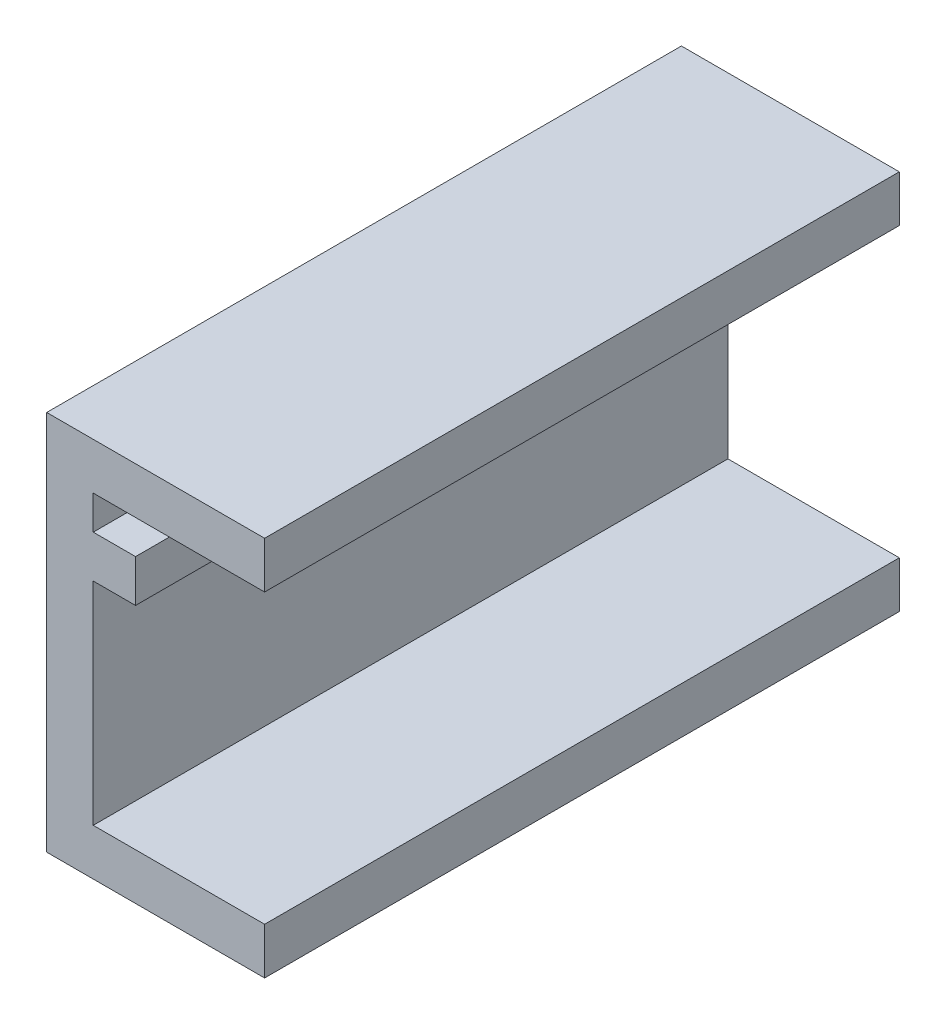
ISO-10303-21;
HEADER;
FILE_DESCRIPTION(('STEP AP214'),'2;1');
FILE_NAME('part.step','',(''),(''),'','','');
FILE_SCHEMA(('AUTOMOTIVE_DESIGN { 1 0 10303 214 1 1 1 1 }'));
ENDSEC;
DATA;
#1=APPLICATION_CONTEXT('core data for automotive mechanical design processes');
#2=APPLICATION_PROTOCOL_DEFINITION('international standard','automotive_design',2000,#1);
#3=PRODUCT_CONTEXT('',#1,'mechanical');
#4=PRODUCT('Part','Part','',(#3));
#5=PRODUCT_RELATED_PRODUCT_CATEGORY('part','',(#4));
#6=PRODUCT_DEFINITION_FORMATION('','',#4);
#7=PRODUCT_DEFINITION_CONTEXT('part definition',#1,'design');
#8=PRODUCT_DEFINITION('design','',#6,#7);
#9=PRODUCT_DEFINITION_SHAPE('','',#8);
#10=(LENGTH_UNIT() NAMED_UNIT(*) SI_UNIT(.MILLI.,.METRE.));
#11=(NAMED_UNIT(*) PLANE_ANGLE_UNIT() SI_UNIT($,.RADIAN.));
#12=(NAMED_UNIT(*) SI_UNIT($,.STERADIAN.) SOLID_ANGLE_UNIT());
#13=UNCERTAINTY_MEASURE_WITH_UNIT(LENGTH_MEASURE(1.E-05),#10,'distance_accuracy_value','');
#14=(GEOMETRIC_REPRESENTATION_CONTEXT(3) GLOBAL_UNCERTAINTY_ASSIGNED_CONTEXT((#13)) GLOBAL_UNIT_ASSIGNED_CONTEXT((#10,
#11,#12)) REPRESENTATION_CONTEXT('',''));
#15=CARTESIAN_POINT('',(0.,0.,0.));
#16=DIRECTION('',(0.,0.,1.));
#17=DIRECTION('',(1.,0.,0.));
#18=AXIS2_PLACEMENT_3D('',#15,#16,#17);
#19=CARTESIAN_POINT('',(-10.3,0.,30.));
#20=DIRECTION('',(0.,1.,0.));
#21=DIRECTION('',(0.,0.,1.));
#22=AXIS2_PLACEMENT_3D('',#19,#20,#21);
#23=PLANE('',#22);
#24=DIRECTION('',(1.,0.,0.));
#25=VECTOR('',#24,1.);
#26=CARTESIAN_POINT('',(-10.3,0.,0.));
#27=LINE('',#26,#25);
#28=CARTESIAN_POINT('',(-10.3,0.,0.));
#29=VERTEX_POINT('',#28);
#30=CARTESIAN_POINT('',(0.,0.,0.));
#31=VERTEX_POINT('',#30);
#32=EDGE_CURVE('E160',#29,#31,#27,.T.);
#33=ORIENTED_EDGE('',*,*,#32,.T.);
#34=DIRECTION('',(0.,0.,-1.));
#35=VECTOR('',#34,1.);
#36=CARTESIAN_POINT('',(0.,0.,30.));
#37=LINE('',#36,#35);
#38=CARTESIAN_POINT('',(0.,0.,30.));
#39=VERTEX_POINT('',#38);
#40=EDGE_CURVE('E11',#39,#31,#37,.T.);
#41=ORIENTED_EDGE('',*,*,#40,.F.);
#42=DIRECTION('',(1.,0.,0.));
#43=VECTOR('',#42,1.);
#44=CARTESIAN_POINT('',(-10.3,0.,30.));
#45=LINE('',#44,#43);
#46=CARTESIAN_POINT('',(-10.3,0.,30.));
#47=VERTEX_POINT('',#46);
#48=EDGE_CURVE('E182',#47,#39,#45,.T.);
#49=ORIENTED_EDGE('',*,*,#48,.F.);
#50=DIRECTION('',(0.,0.,-1.));
#51=VECTOR('',#50,1.);
#52=CARTESIAN_POINT('',(-10.3,0.,30.));
#53=LINE('',#52,#51);
#54=EDGE_CURVE('E156',#47,#29,#53,.T.);
#55=ORIENTED_EDGE('',*,*,#54,.T.);
#56=EDGE_LOOP('',(#33,#41,#49,#55));
#57=FACE_BOUND('',#56,.T.);
#58=ADVANCED_FACE('F40',(#57),#23,.F.);
#59=CARTESIAN_POINT('',(0.,2.2,30.));
#60=DIRECTION('',(-1.,0.,0.));
#61=DIRECTION('',(0.,0.,1.));
#62=AXIS2_PLACEMENT_3D('',#59,#60,#61);
#63=PLANE('',#62);
#64=DIRECTION('',(0.,1.,0.));
#65=VECTOR('',#64,1.);
#66=CARTESIAN_POINT('',(0.,2.2,0.));
#67=LINE('',#66,#65);
#68=CARTESIAN_POINT('',(0.,2.2,0.));
#69=VERTEX_POINT('',#68);
#70=EDGE_CURVE('E163',#31,#69,#67,.T.);
#71=ORIENTED_EDGE('',*,*,#70,.T.);
#72=DIRECTION('',(0.,0.,-1.));
#73=VECTOR('',#72,1.);
#74=CARTESIAN_POINT('',(0.,2.2,30.));
#75=LINE('',#74,#73);
#76=CARTESIAN_POINT('',(0.,2.2,30.));
#77=VERTEX_POINT('',#76);
#78=EDGE_CURVE('E48',#77,#69,#75,.T.);
#79=ORIENTED_EDGE('',*,*,#78,.F.);
#80=DIRECTION('',(0.,1.,0.));
#81=VECTOR('',#80,1.);
#82=CARTESIAN_POINT('',(0.,2.2,30.));
#83=LINE('',#82,#81);
#84=EDGE_CURVE('E111',#39,#77,#83,.T.);
#85=ORIENTED_EDGE('',*,*,#84,.F.);
#86=ORIENTED_EDGE('',*,*,#40,.T.);
#87=EDGE_LOOP('',(#71,#79,#85,#86));
#88=FACE_BOUND('',#87,.T.);
#89=ADVANCED_FACE('F260',(#88),#63,.F.);
#90=CARTESIAN_POINT('',(-8.1,2.2,30.));
#91=DIRECTION('',(0.,-1.,0.));
#92=DIRECTION('',(1.,0.,0.));
#93=AXIS2_PLACEMENT_3D('',#90,#91,#92);
#94=PLANE('',#93);
#95=DIRECTION('',(-1.,0.,0.));
#96=VECTOR('',#95,1.);
#97=CARTESIAN_POINT('',(-8.1,2.2,0.));
#98=LINE('',#97,#96);
#99=CARTESIAN_POINT('',(-8.1,2.2,0.));
#100=VERTEX_POINT('',#99);
#101=EDGE_CURVE('E165',#69,#100,#98,.T.);
#102=ORIENTED_EDGE('',*,*,#101,.T.);
#103=DIRECTION('',(0.,0.,-1.));
#104=VECTOR('',#103,1.);
#105=CARTESIAN_POINT('',(-8.1,2.2,30.));
#106=LINE('',#105,#104);
#107=CARTESIAN_POINT('',(-8.1,2.2,30.));
#108=VERTEX_POINT('',#107);
#109=EDGE_CURVE('E201',#108,#100,#106,.T.);
#110=ORIENTED_EDGE('',*,*,#109,.F.);
#111=DIRECTION('',(-1.,0.,0.));
#112=VECTOR('',#111,1.);
#113=CARTESIAN_POINT('',(-8.1,2.2,30.));
#114=LINE('',#113,#112);
#115=EDGE_CURVE('E209',#77,#108,#114,.T.);
#116=ORIENTED_EDGE('',*,*,#115,.F.);
#117=ORIENTED_EDGE('',*,*,#78,.T.);
#118=EDGE_LOOP('',(#102,#110,#116,#117));
#119=FACE_BOUND('',#118,.T.);
#120=ADVANCED_FACE('F207',(#119),#94,.F.);
#121=CARTESIAN_POINT('',(-8.1,12.2,30.));
#122=DIRECTION('',(-1.,0.,0.));
#123=DIRECTION('',(0.,-1.,0.));
#124=AXIS2_PLACEMENT_3D('',#121,#122,#123);
#125=PLANE('',#124);
#126=DIRECTION('',(0.,1.,0.));
#127=VECTOR('',#126,1.);
#128=CARTESIAN_POINT('',(-8.1,12.2,0.));
#129=LINE('',#128,#127);
#130=CARTESIAN_POINT('',(-8.1,12.2,0.));
#131=VERTEX_POINT('',#130);
#132=EDGE_CURVE('E167',#100,#131,#129,.T.);
#133=ORIENTED_EDGE('',*,*,#132,.T.);
#134=DIRECTION('',(0.,0.,-1.));
#135=VECTOR('',#134,1.);
#136=CARTESIAN_POINT('',(-8.1,12.2,30.));
#137=LINE('',#136,#135);
#138=CARTESIAN_POINT('',(-8.1,12.2,30.));
#139=VERTEX_POINT('',#138);
#140=EDGE_CURVE('E198',#139,#131,#137,.T.);
#141=ORIENTED_EDGE('',*,*,#140,.F.);
#142=DIRECTION('',(0.,1.,0.));
#143=VECTOR('',#142,1.);
#144=CARTESIAN_POINT('',(-8.1,12.2,30.));
#145=LINE('',#144,#143);
#146=EDGE_CURVE('E227',#108,#139,#145,.T.);
#147=ORIENTED_EDGE('',*,*,#146,.F.);
#148=ORIENTED_EDGE('',*,*,#109,.T.);
#149=EDGE_LOOP('',(#133,#141,#147,#148));
#150=FACE_BOUND('',#149,.T.);
#151=ADVANCED_FACE('F218',(#150),#125,.F.);
#152=CARTESIAN_POINT('',(-6.1,12.2,30.));
#153=DIRECTION('',(0.,1.,0.));
#154=DIRECTION('',(-1.,0.,0.));
#155=AXIS2_PLACEMENT_3D('',#152,#153,#154);
#156=PLANE('',#155);
#157=DIRECTION('',(1.,0.,0.));
#158=VECTOR('',#157,1.);
#159=CARTESIAN_POINT('',(-6.1,12.2,0.));
#160=LINE('',#159,#158);
#161=CARTESIAN_POINT('',(-6.1,12.2,0.));
#162=VERTEX_POINT('',#161);
#163=EDGE_CURVE('E169',#131,#162,#160,.T.);
#164=ORIENTED_EDGE('',*,*,#163,.T.);
#165=DIRECTION('',(0.,0.,-1.));
#166=VECTOR('',#165,1.);
#167=CARTESIAN_POINT('',(-6.1,12.2,30.));
#168=LINE('',#167,#166);
#169=CARTESIAN_POINT('',(-6.1,12.2,30.));
#170=VERTEX_POINT('',#169);
#171=EDGE_CURVE('E195',#170,#162,#168,.T.);
#172=ORIENTED_EDGE('',*,*,#171,.F.);
#173=DIRECTION('',(1.,0.,0.));
#174=VECTOR('',#173,1.);
#175=CARTESIAN_POINT('',(-6.1,12.2,30.));
#176=LINE('',#175,#174);
#177=EDGE_CURVE('E224',#139,#170,#176,.T.);
#178=ORIENTED_EDGE('',*,*,#177,.F.);
#179=ORIENTED_EDGE('',*,*,#140,.T.);
#180=EDGE_LOOP('',(#164,#172,#178,#179));
#181=FACE_BOUND('',#180,.T.);
#182=ADVANCED_FACE('F222',(#181),#156,.F.);
#183=CARTESIAN_POINT('',(-6.1,14.2,30.));
#184=DIRECTION('',(-1.,0.,0.));
#185=DIRECTION('',(0.,0.,1.));
#186=AXIS2_PLACEMENT_3D('',#183,#184,#185);
#187=PLANE('',#186);
#188=DIRECTION('',(0.,1.,0.));
#189=VECTOR('',#188,1.);
#190=CARTESIAN_POINT('',(-6.1,14.2,0.));
#191=LINE('',#190,#189);
#192=CARTESIAN_POINT('',(-6.1,14.2,0.));
#193=VERTEX_POINT('',#192);
#194=EDGE_CURVE('E171',#162,#193,#191,.T.);
#195=ORIENTED_EDGE('',*,*,#194,.T.);
#196=DIRECTION('',(0.,0.,-1.));
#197=VECTOR('',#196,1.);
#198=CARTESIAN_POINT('',(-6.1,14.2,30.));
#199=LINE('',#198,#197);
#200=CARTESIAN_POINT('',(-6.1,14.2,30.));
#201=VERTEX_POINT('',#200);
#202=EDGE_CURVE('E192',#201,#193,#199,.T.);
#203=ORIENTED_EDGE('',*,*,#202,.F.);
#204=DIRECTION('',(0.,1.,0.));
#205=VECTOR('',#204,1.);
#206=CARTESIAN_POINT('',(-6.1,14.2,30.));
#207=LINE('',#206,#205);
#208=EDGE_CURVE('E226',#170,#201,#207,.T.);
#209=ORIENTED_EDGE('',*,*,#208,.F.);
#210=ORIENTED_EDGE('',*,*,#171,.T.);
#211=EDGE_LOOP('',(#195,#203,#209,#210));
#212=FACE_BOUND('',#211,.T.);
#213=ADVANCED_FACE('F273',(#212),#187,.F.);
#214=CARTESIAN_POINT('',(-8.1,14.2,30.));
#215=DIRECTION('',(0.,-1.,0.));
#216=DIRECTION('',(1.,0.,0.));
#217=AXIS2_PLACEMENT_3D('',#214,#215,#216);
#218=PLANE('',#217);
#219=DIRECTION('',(-1.,0.,0.));
#220=VECTOR('',#219,1.);
#221=CARTESIAN_POINT('',(-8.1,14.2,0.));
#222=LINE('',#221,#220);
#223=CARTESIAN_POINT('',(-8.1,14.2,0.));
#224=VERTEX_POINT('',#223);
#225=EDGE_CURVE('E173',#193,#224,#222,.T.);
#226=ORIENTED_EDGE('',*,*,#225,.T.);
#227=DIRECTION('',(0.,0.,-1.));
#228=VECTOR('',#227,1.);
#229=CARTESIAN_POINT('',(-8.1,14.2,30.));
#230=LINE('',#229,#228);
#231=CARTESIAN_POINT('',(-8.1,14.2,30.));
#232=VERTEX_POINT('',#231);
#233=EDGE_CURVE('E189',#232,#224,#230,.T.);
#234=ORIENTED_EDGE('',*,*,#233,.F.);
#235=DIRECTION('',(-1.,0.,0.));
#236=VECTOR('',#235,1.);
#237=CARTESIAN_POINT('',(-8.1,14.2,30.));
#238=LINE('',#237,#236);
#239=EDGE_CURVE('E229',#201,#232,#238,.T.);
#240=ORIENTED_EDGE('',*,*,#239,.F.);
#241=ORIENTED_EDGE('',*,*,#202,.T.);
#242=EDGE_LOOP('',(#226,#234,#240,#241));
#243=FACE_BOUND('',#242,.T.);
#244=ADVANCED_FACE('F276',(#243),#218,.F.);
#245=CARTESIAN_POINT('',(-8.1,14.2,30.));
#246=DIRECTION('',(-1.,0.,0.));
#247=DIRECTION('',(0.,0.,1.));
#248=AXIS2_PLACEMENT_3D('',#245,#246,#247);
#249=PLANE('',#248);
#250=DIRECTION('',(0.,1.,0.));
#251=VECTOR('',#250,1.);
#252=CARTESIAN_POINT('',(-8.1,14.2,0.));
#253=LINE('',#252,#251);
#254=CARTESIAN_POINT('',(-8.1,15.8,0.));
#255=VERTEX_POINT('',#254);
#256=EDGE_CURVE('E175',#224,#255,#253,.T.);
#257=ORIENTED_EDGE('',*,*,#256,.T.);
#258=DIRECTION('',(0.,0.,-1.));
#259=VECTOR('',#258,1.);
#260=CARTESIAN_POINT('',(-8.1,15.8,30.));
#261=LINE('',#260,#259);
#262=CARTESIAN_POINT('',(-8.1,15.8,30.));
#263=VERTEX_POINT('',#262);
#264=EDGE_CURVE('E186',#263,#255,#261,.T.);
#265=ORIENTED_EDGE('',*,*,#264,.F.);
#266=DIRECTION('',(0.,1.,0.));
#267=VECTOR('',#266,1.);
#268=CARTESIAN_POINT('',(-8.1,14.2,30.));
#269=LINE('',#268,#267);
#270=EDGE_CURVE('E235',#232,#263,#269,.T.);
#271=ORIENTED_EDGE('',*,*,#270,.F.);
#272=ORIENTED_EDGE('',*,*,#233,.T.);
#273=EDGE_LOOP('',(#257,#265,#271,#272));
#274=FACE_BOUND('',#273,.T.);
#275=ADVANCED_FACE('F241',(#274),#249,.F.);
#276=CARTESIAN_POINT('',(-8.1,15.8,30.));
#277=DIRECTION('',(0.,1.,0.));
#278=DIRECTION('',(-1.,0.,0.));
#279=AXIS2_PLACEMENT_3D('',#276,#277,#278);
#280=PLANE('',#279);
#281=DIRECTION('',(1.,0.,0.));
#282=VECTOR('',#281,1.);
#283=CARTESIAN_POINT('',(-8.1,15.8,0.));
#284=LINE('',#283,#282);
#285=CARTESIAN_POINT('',(0.,15.8,0.));
#286=VERTEX_POINT('',#285);
#287=EDGE_CURVE('E177',#255,#286,#284,.T.);
#288=ORIENTED_EDGE('',*,*,#287,.T.);
#289=DIRECTION('',(0.,0.,-1.));
#290=VECTOR('',#289,1.);
#291=CARTESIAN_POINT('',(0.,15.8,30.));
#292=LINE('',#291,#290);
#293=CARTESIAN_POINT('',(0.,15.8,30.));
#294=VERTEX_POINT('',#293);
#295=EDGE_CURVE('E151',#294,#286,#292,.T.);
#296=ORIENTED_EDGE('',*,*,#295,.F.);
#297=DIRECTION('',(1.,0.,0.));
#298=VECTOR('',#297,1.);
#299=CARTESIAN_POINT('',(-8.1,15.8,30.));
#300=LINE('',#299,#298);
#301=EDGE_CURVE('E142',#263,#294,#300,.T.);
#302=ORIENTED_EDGE('',*,*,#301,.F.);
#303=ORIENTED_EDGE('',*,*,#264,.T.);
#304=EDGE_LOOP('',(#288,#296,#302,#303));
#305=FACE_BOUND('',#304,.T.);
#306=ADVANCED_FACE('F245',(#305),#280,.F.);
#307=CARTESIAN_POINT('',(0.,15.8,30.));
#308=DIRECTION('',(-1.,0.,0.));
#309=DIRECTION('',(0.,0.,1.));
#310=AXIS2_PLACEMENT_3D('',#307,#308,#309);
#311=PLANE('',#310);
#312=DIRECTION('',(0.,1.,0.));
#313=VECTOR('',#312,1.);
#314=CARTESIAN_POINT('',(0.,15.8,0.));
#315=LINE('',#314,#313);
#316=CARTESIAN_POINT('',(0.,18.,0.));
#317=VERTEX_POINT('',#316);
#318=EDGE_CURVE('E150',#286,#317,#315,.T.);
#319=ORIENTED_EDGE('',*,*,#318,.T.);
#320=DIRECTION('',(0.,0.,-1.));
#321=VECTOR('',#320,1.);
#322=CARTESIAN_POINT('',(0.,18.,30.));
#323=LINE('',#322,#321);
#324=CARTESIAN_POINT('',(0.,18.,30.));
#325=VERTEX_POINT('',#324);
#326=EDGE_CURVE('E147',#325,#317,#323,.T.);
#327=ORIENTED_EDGE('',*,*,#326,.F.);
#328=DIRECTION('',(0.,1.,0.));
#329=VECTOR('',#328,1.);
#330=CARTESIAN_POINT('',(0.,15.8,30.));
#331=LINE('',#330,#329);
#332=EDGE_CURVE('E136',#294,#325,#331,.T.);
#333=ORIENTED_EDGE('',*,*,#332,.F.);
#334=ORIENTED_EDGE('',*,*,#295,.T.);
#335=EDGE_LOOP('',(#319,#327,#333,#334));
#336=FACE_BOUND('',#335,.T.);
#337=ADVANCED_FACE('F148',(#336),#311,.F.);
#338=CARTESIAN_POINT('',(0.,18.,30.));
#339=DIRECTION('',(0.,-1.,0.));
#340=DIRECTION('',(1.,0.,0.));
#341=AXIS2_PLACEMENT_3D('',#338,#339,#340);
#342=PLANE('',#341);
#343=DIRECTION('',(-1.,0.,0.));
#344=VECTOR('',#343,1.);
#345=CARTESIAN_POINT('',(0.,18.,0.));
#346=LINE('',#345,#344);
#347=CARTESIAN_POINT('',(-10.3,18.,0.));
#348=VERTEX_POINT('',#347);
#349=EDGE_CURVE('E97',#317,#348,#346,.T.);
#350=ORIENTED_EDGE('',*,*,#349,.T.);
#351=DIRECTION('',(0.,0.,-1.));
#352=VECTOR('',#351,1.);
#353=CARTESIAN_POINT('',(-10.3,18.,30.));
#354=LINE('',#353,#352);
#355=CARTESIAN_POINT('',(-10.3,18.,30.));
#356=VERTEX_POINT('',#355);
#357=EDGE_CURVE('E152',#356,#348,#354,.T.);
#358=ORIENTED_EDGE('',*,*,#357,.F.);
#359=DIRECTION('',(-1.,0.,0.));
#360=VECTOR('',#359,1.);
#361=CARTESIAN_POINT('',(0.,18.,30.));
#362=LINE('',#361,#360);
#363=EDGE_CURVE('E140',#325,#356,#362,.T.);
#364=ORIENTED_EDGE('',*,*,#363,.F.);
#365=ORIENTED_EDGE('',*,*,#326,.T.);
#366=EDGE_LOOP('',(#350,#358,#364,#365));
#367=FACE_BOUND('',#366,.T.);
#368=ADVANCED_FACE('F154',(#367),#342,.F.);
#369=CARTESIAN_POINT('',(-10.3,18.,30.));
#370=DIRECTION('',(1.,0.,0.));
#371=DIRECTION('',(0.,1.,0.));
#372=AXIS2_PLACEMENT_3D('',#369,#370,#371);
#373=PLANE('',#372);
#374=DIRECTION('',(0.,-1.,0.));
#375=VECTOR('',#374,1.);
#376=CARTESIAN_POINT('',(-10.3,18.,0.));
#377=LINE('',#376,#375);
#378=EDGE_CURVE('E103',#348,#29,#377,.T.);
#379=ORIENTED_EDGE('',*,*,#378,.T.);
#380=ORIENTED_EDGE('',*,*,#54,.F.);
#381=DIRECTION('',(0.,-1.,0.));
#382=VECTOR('',#381,1.);
#383=CARTESIAN_POINT('',(-10.3,18.,30.));
#384=LINE('',#383,#382);
#385=EDGE_CURVE('E56',#356,#47,#384,.T.);
#386=ORIENTED_EDGE('',*,*,#385,.F.);
#387=ORIENTED_EDGE('',*,*,#357,.T.);
#388=EDGE_LOOP('',(#379,#380,#386,#387));
#389=FACE_BOUND('',#388,.T.);
#390=ADVANCED_FACE('F249',(#389),#373,.F.);
#391=CARTESIAN_POINT('',(0.,0.,30.));
#392=DIRECTION('',(0.,0.,-1.));
#393=DIRECTION('',(-1.,0.,0.));
#394=AXIS2_PLACEMENT_3D('',#391,#392,#393);
#395=PLANE('',#394);
#396=ORIENTED_EDGE('',*,*,#48,.T.);
#397=ORIENTED_EDGE('',*,*,#84,.T.);
#398=ORIENTED_EDGE('',*,*,#115,.T.);
#399=ORIENTED_EDGE('',*,*,#146,.T.);
#400=ORIENTED_EDGE('',*,*,#177,.T.);
#401=ORIENTED_EDGE('',*,*,#208,.T.);
#402=ORIENTED_EDGE('',*,*,#239,.T.);
#403=ORIENTED_EDGE('',*,*,#270,.T.);
#404=ORIENTED_EDGE('',*,*,#301,.T.);
#405=ORIENTED_EDGE('',*,*,#332,.T.);
#406=ORIENTED_EDGE('',*,*,#363,.T.);
#407=ORIENTED_EDGE('',*,*,#385,.T.);
#408=EDGE_LOOP('',(#396,#397,#398,#399,#400,#401,#402,#403,#404,#405,#406,#407));
#409=FACE_BOUND('',#408,.T.);
#410=ADVANCED_FACE('F138',(#409),#395,.F.);
#411=CARTESIAN_POINT('',(0.,0.,0.));
#412=DIRECTION('',(0.,0.,-1.));
#413=DIRECTION('',(-1.,0.,0.));
#414=AXIS2_PLACEMENT_3D('',#411,#412,#413);
#415=PLANE('',#414);
#416=ORIENTED_EDGE('',*,*,#32,.F.);
#417=ORIENTED_EDGE('',*,*,#378,.F.);
#418=ORIENTED_EDGE('',*,*,#349,.F.);
#419=ORIENTED_EDGE('',*,*,#318,.F.);
#420=ORIENTED_EDGE('',*,*,#287,.F.);
#421=ORIENTED_EDGE('',*,*,#256,.F.);
#422=ORIENTED_EDGE('',*,*,#225,.F.);
#423=ORIENTED_EDGE('',*,*,#194,.F.);
#424=ORIENTED_EDGE('',*,*,#163,.F.);
#425=ORIENTED_EDGE('',*,*,#132,.F.);
#426=ORIENTED_EDGE('',*,*,#101,.F.);
#427=ORIENTED_EDGE('',*,*,#70,.F.);
#428=EDGE_LOOP('',(#416,#417,#418,#419,#420,#421,#422,#423,#424,#425,#426,#427));
#429=FACE_BOUND('',#428,.T.);
#430=ADVANCED_FACE('F213',(#429),#415,.T.);
#431=CLOSED_SHELL('',(#58,#89,#120,#151,#182,#213,#244,#275,#306,#337,#368,#390,#410,#430));
#432=MANIFOLD_SOLID_BREP('B2',#431);
#433=ADVANCED_BREP_SHAPE_REPRESENTATION('',(#18,#432),#14);
#434=SHAPE_DEFINITION_REPRESENTATION(#9,#433);
ENDSEC;
END-ISO-10303-21;
